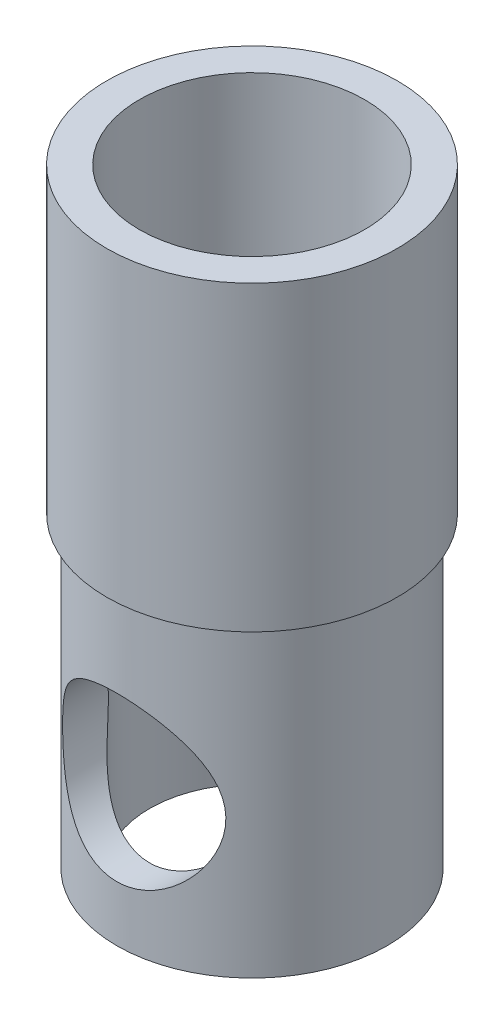
ISO-10303-21;
HEADER;
FILE_DESCRIPTION(('STEP AP214'),'2;1');
FILE_NAME('part.step','',(''),(''),'','','');
FILE_SCHEMA(('AUTOMOTIVE_DESIGN { 1 0 10303 214 1 1 1 1 }'));
ENDSEC;
DATA;
#1=APPLICATION_CONTEXT('core data for automotive mechanical design processes');
#2=APPLICATION_PROTOCOL_DEFINITION('international standard','automotive_design',2000,#1);
#3=PRODUCT_CONTEXT('',#1,'mechanical');
#4=PRODUCT('Part','Part','',(#3));
#5=PRODUCT_RELATED_PRODUCT_CATEGORY('part','',(#4));
#6=PRODUCT_DEFINITION_FORMATION('','',#4);
#7=PRODUCT_DEFINITION_CONTEXT('part definition',#1,'design');
#8=PRODUCT_DEFINITION('design','',#6,#7);
#9=PRODUCT_DEFINITION_SHAPE('','',#8);
#10=(LENGTH_UNIT() NAMED_UNIT(*) SI_UNIT(.MILLI.,.METRE.));
#11=(NAMED_UNIT(*) PLANE_ANGLE_UNIT() SI_UNIT($,.RADIAN.));
#12=(NAMED_UNIT(*) SI_UNIT($,.STERADIAN.) SOLID_ANGLE_UNIT());
#13=UNCERTAINTY_MEASURE_WITH_UNIT(LENGTH_MEASURE(1.E-05),#10,'distance_accuracy_value','');
#14=(GEOMETRIC_REPRESENTATION_CONTEXT(3) GLOBAL_UNCERTAINTY_ASSIGNED_CONTEXT((#13)) GLOBAL_UNIT_ASSIGNED_CONTEXT((#10,
#11,#12)) REPRESENTATION_CONTEXT('',''));
#15=CARTESIAN_POINT('',(0.,0.,0.));
#16=DIRECTION('',(0.,0.,1.));
#17=DIRECTION('',(1.,0.,0.));
#18=AXIS2_PLACEMENT_3D('',#15,#16,#17);
#19=CARTESIAN_POINT('',(0.,-17.8,0.));
#20=DIRECTION('',(0.,1.,0.));
#21=DIRECTION('',(0.,0.,1.));
#22=AXIS2_PLACEMENT_3D('',#19,#20,#21);
#23=CYLINDRICAL_SURFACE('',#22,8.28);
#24=CARTESIAN_POINT('',(0.,1.,0.));
#25=DIRECTION('',(0.,1.,0.));
#26=DIRECTION('',(0.,0.,1.));
#27=AXIS2_PLACEMENT_3D('',#24,#25,#26);
#28=CIRCLE('',#27,8.28);
#29=CARTESIAN_POINT('',(0.,1.,8.28));
#30=VERTEX_POINT('',#29);
#31=EDGE_CURVE('E47',#30,#30,#28,.T.);
#32=ORIENTED_EDGE('',*,*,#31,.F.);
#33=EDGE_LOOP('',(#32));
#34=FACE_BOUND('',#33,.T.);
#35=CARTESIAN_POINT('',(0.,-17.8,0.));
#36=DIRECTION('',(0.,1.,0.));
#37=DIRECTION('',(0.,0.,1.));
#38=AXIS2_PLACEMENT_3D('',#35,#36,#37);
#39=CIRCLE('',#38,8.28);
#40=CARTESIAN_POINT('',(0.,-17.8,8.28));
#41=VERTEX_POINT('',#40);
#42=EDGE_CURVE('E10',#41,#41,#39,.T.);
#43=ORIENTED_EDGE('',*,*,#42,.T.);
#44=EDGE_LOOP('',(#43));
#45=FACE_BOUND('',#44,.T.);
#46=CARTESIAN_POINT('',(0.,-14.4,8.28));
#47=CARTESIAN_POINT('',(-0.127814799959021,-14.399998989137,8.27999905401698));
#48=CARTESIAN_POINT('',(-0.2556580150913,-14.3950915080494,8.27703307383215));
#49=CARTESIAN_POINT('',(-0.510377679655769,-14.3755247882118,8.26523972434308));
#50=CARTESIAN_POINT('',(-0.637253545087955,-14.3608600678983,8.25640906029679));
#51=CARTESIAN_POINT('',(-0.889236612027991,-14.3219445877026,8.23308541018477));
#52=CARTESIAN_POINT('',(-1.01434015993517,-14.2976763684179,8.218582111688));
#53=CARTESIAN_POINT('',(-1.26168781014748,-14.2398642187082,8.18426205287179));
#54=CARTESIAN_POINT('',(-1.38393066550779,-14.2063163221467,8.16444302071664));
#55=CARTESIAN_POINT('',(-1.62406390141582,-14.1305578613842,8.12007628986708));
#56=CARTESIAN_POINT('',(-1.74197432894678,-14.0883953764538,8.09555488057994));
#57=CARTESIAN_POINT('',(-1.97350044520933,-13.9957441753168,8.04225312491289));
#58=CARTESIAN_POINT('',(-2.08711447483184,-13.9452522821589,8.01347115392769));
#59=CARTESIAN_POINT('',(-2.42048477896346,-13.7820509159312,7.92165580081726));
#60=CARTESIAN_POINT('',(-2.63306677536784,-13.6575205935488,7.85309574177827));
#61=CARTESIAN_POINT('',(-3.05094236899353,-13.370019231831,7.70087245643425));
#62=CARTESIAN_POINT('',(-3.2544139066575,-13.2048263790288,7.61645272728185));
#63=CARTESIAN_POINT('',(-3.6325660758696,-12.8456568346002,7.44353089859535));
#64=CARTESIAN_POINT('',(-3.80720890101852,-12.6516429699368,7.35502363012309));
#65=CARTESIAN_POINT('',(-4.14477814512416,-12.211934590916,7.17081535323676));
#66=CARTESIAN_POINT('',(-4.30353531322219,-11.9628128830754,7.07559156402027));
#67=CARTESIAN_POINT('',(-4.57635785947899,-11.4358280340893,6.90228727460239));
#68=CARTESIAN_POINT('',(-4.69049629710975,-11.1580128273752,6.8241788423886));
#69=CARTESIAN_POINT('',(-4.84643888571484,-10.6506931448338,6.71395784927723));
#70=CARTESIAN_POINT('',(-4.89910112224796,-10.4259611828117,6.67527072976169));
#71=CARTESIAN_POINT('',(-4.97291736325497,-9.96879628547392,6.620474860866));
#72=CARTESIAN_POINT('',(-4.99411133116625,-9.73637350154435,6.60433747576561));
#73=CARTESIAN_POINT('',(-5.00375967004685,-9.26996523743167,6.59703273740004));
#74=CARTESIAN_POINT('',(-4.99214675538867,-9.0359775289862,6.60591670182657));
#75=CARTESIAN_POINT('',(-4.93678463229914,-8.57392935931796,6.64738180811096));
#76=CARTESIAN_POINT('',(-4.893010987544,-8.34587354175881,6.67998096903299));
#77=CARTESIAN_POINT('',(-4.7765378674834,-7.90464933496691,6.76373237143766));
#78=CARTESIAN_POINT('',(-4.70426176575395,-7.69131447378392,6.81461213213665));
#79=CARTESIAN_POINT('',(-4.53345607100019,-7.27925094601696,6.92941090138581));
#80=CARTESIAN_POINT('',(-4.43491691120353,-7.08052763566577,6.99333465944446));
#81=CARTESIAN_POINT('',(-4.19434974772518,-6.66602965119449,7.14066242358086));
#82=CARTESIAN_POINT('',(-4.04771356980097,-6.4534490069667,7.22551257098683));
#83=CARTESIAN_POINT('',(-3.72395137644406,-6.05360065525499,7.39757957508199));
#84=CARTESIAN_POINT('',(-3.54679583070187,-5.86635778066316,7.48479865443306));
#85=CARTESIAN_POINT('',(-3.2464840236777,-5.59446685026863,7.61794495875607));
#86=CARTESIAN_POINT('',(-3.13264755828196,-5.50019596144178,7.66557498622801));
#87=CARTESIAN_POINT('',(-2.89633506754753,-5.32162326163593,7.75794499190333));
#88=CARTESIAN_POINT('',(-2.77386239663795,-5.23731761369317,7.80268607941834));
#89=CARTESIAN_POINT('',(-2.52082809644101,-5.07938983058989,7.88807083689139));
#90=CARTESIAN_POINT('',(-2.39026528799418,-5.00576925805934,7.92871390727352));
#91=CARTESIAN_POINT('',(-2.1218842491955,-4.87007775285377,8.00471342565388));
#92=CARTESIAN_POINT('',(-1.98407055912673,-4.80799970047281,8.04007312989869));
#93=CARTESIAN_POINT('',(-1.71074312298416,-4.69961425777457,8.10248027134194));
#94=CARTESIAN_POINT('',(-1.57560677302415,-4.65257310455158,8.12990452172536));
#95=CARTESIAN_POINT('',(-1.30080558918942,-4.57004458421711,8.17837104429402));
#96=CARTESIAN_POINT('',(-1.16114335151334,-4.53455071782873,8.19941690603458));
#97=CARTESIAN_POINT('',(-0.878528653152941,-4.47567205662101,8.23449127571659));
#98=CARTESIAN_POINT('',(-0.735578765756743,-4.45227810677489,8.24852508883336));
#99=CARTESIAN_POINT('',(-0.447663505369589,-4.41797175889034,8.26914840748581));
#100=CARTESIAN_POINT('',(-0.302698427690869,-4.40705755114698,8.27573899237276));
#101=CARTESIAN_POINT('',(-0.032303478460747,-4.39853534307774,8.28088420590736));
#102=CARTESIAN_POINT('',(0.0930599039964685,-4.39929811604266,8.28042278080918));
#103=CARTESIAN_POINT('',(0.343269314852998,-4.41022557838245,8.27382793650194));
#104=CARTESIAN_POINT('',(0.468115171826912,-4.42039316644576,8.26769276857042));
#105=CARTESIAN_POINT('',(0.716246544654471,-4.44999015781219,8.24990049826994));
#106=CARTESIAN_POINT('',(0.83953270079289,-4.46941562498298,8.23824574265339));
#107=CARTESIAN_POINT('',(1.0837671643727,-4.51728128010887,8.20968779420892));
#108=CARTESIAN_POINT('',(1.20471455126711,-4.54572494399462,8.19278257771984));
#109=CARTESIAN_POINT('',(1.44022006490596,-4.61039968831374,8.15463102909104));
#110=CARTESIAN_POINT('',(1.55486254010749,-4.64640040605383,8.13351387427528));
#111=CARTESIAN_POINT('',(1.78053348847966,-4.72623870429255,8.08711291225984));
#112=CARTESIAN_POINT('',(1.89156070189417,-4.77007898270104,8.06182767088794));
#113=CARTESIAN_POINT('',(2.21831819512106,-4.91274332545923,7.9804588927263));
#114=CARTESIAN_POINT('',(2.42790065021433,-5.02275999554512,7.91883260875659));
#115=CARTESIAN_POINT('',(2.84772741198661,-5.28204383555201,7.77835949917836));
#116=CARTESIAN_POINT('',(3.05579573269604,-5.43419467003682,7.69839056763918));
#117=CARTESIAN_POINT('',(3.44503942992681,-5.76717766913709,7.53226084102553));
#118=CARTESIAN_POINT('',(3.62618313957044,-5.94804309707899,7.44609292907667));
#119=CARTESIAN_POINT('',(3.98117274187309,-6.36124860152288,7.26316751896415));
#120=CARTESIAN_POINT('',(4.15085858866158,-6.59723456564839,7.16652254065104));
#121=CARTESIAN_POINT('',(4.44837831603031,-7.09853925368765,6.9857466968751));
#122=CARTESIAN_POINT('',(4.57625423649267,-7.3638281520823,6.90160330781262));
#123=CARTESIAN_POINT('',(4.76231972800488,-7.85913401022268,6.77411663386007));
#124=CARTESIAN_POINT('',(4.82958880733965,-8.08442824547146,6.72588835203027));
#125=CARTESIAN_POINT('',(4.90645334289188,-8.43010918474908,6.66978882403382));
#126=CARTESIAN_POINT('',(4.92806694679441,-8.54660861867642,6.65379727389108));
#127=CARTESIAN_POINT('',(4.96301423923288,-8.78148343995689,6.62777315179953));
#128=CARTESIAN_POINT('',(4.97635113384399,-8.8998580826819,6.61773827253376));
#129=CARTESIAN_POINT('',(4.99457389134283,-9.13813507159654,6.60399588520129));
#130=CARTESIAN_POINT('',(4.9994232455336,-9.25804179355239,6.60031571246763));
#131=CARTESIAN_POINT('',(5.00047976543356,-9.49791537217881,6.59951533865));
#132=CARTESIAN_POINT('',(4.9966869213365,-9.61788222891747,6.60239514500959));
#133=CARTESIAN_POINT('',(4.98051796908317,-9.85693817185625,6.6146008289241));
#134=CARTESIAN_POINT('',(4.96813960585116,-9.97602701913064,6.62392840004923));
#135=CARTESIAN_POINT('',(4.93500346073603,-10.2124100232206,6.64865075419455));
#136=CARTESIAN_POINT('',(4.91424239791221,-10.329703458644,6.66404791276061));
#137=CARTESIAN_POINT('',(4.84245682056759,-10.6652772892124,6.71658108347069));
#138=CARTESIAN_POINT('',(4.78095689159326,-10.8802998381778,6.76085655038456));
#139=CARTESIAN_POINT('',(4.63147885920864,-11.2969850696229,6.86410778629985));
#140=CARTESIAN_POINT('',(4.54349071964827,-11.4986426528358,6.92308912576948));
#141=CARTESIAN_POINT('',(4.32813027370673,-11.9160567206369,7.06005302022736));
#142=CARTESIAN_POINT('',(4.19679537859072,-12.129262968751,7.13956179724272));
#143=CARTESIAN_POINT('',(3.9048278127975,-12.5327931308518,7.30333616820837));
#144=CARTESIAN_POINT('',(3.74417091014908,-12.7230979013931,7.3876056563851));
#145=CARTESIAN_POINT('',(3.46833519197884,-13.0044127538445,7.51942975837754));
#146=CARTESIAN_POINT('',(3.36195607484711,-13.1038522423125,7.56770623125841));
#147=CARTESIAN_POINT('',(3.14042977533258,-13.2934484798563,7.66228320630056));
#148=CARTESIAN_POINT('',(3.02528551187502,-13.3836082958806,7.70858435832757));
#149=CARTESIAN_POINT('',(2.78659253045055,-13.5540863188849,7.79804885598916));
#150=CARTESIAN_POINT('',(2.66303575578666,-13.6343948791042,7.84120910937004));
#151=CARTESIAN_POINT('',(2.40828529952102,-13.7842884755299,7.92315902789155));
#152=CARTESIAN_POINT('',(2.27709594594655,-13.8538795089726,7.96195113403718));
#153=CARTESIAN_POINT('',(2.01123114332619,-13.9799604972123,8.03316885406246));
#154=CARTESIAN_POINT('',(1.87672961448513,-14.0367390139502,8.06573146764511));
#155=CARTESIAN_POINT('',(1.6021499842605,-14.1386221392424,8.12472858617453));
#156=CARTESIAN_POINT('',(1.46207519168216,-14.1837335585748,8.15116666543145));
#157=CARTESIAN_POINT('',(1.17784251923966,-14.2615157720931,8.19705753914945));
#158=CARTESIAN_POINT('',(1.03369775047637,-14.294222493737,8.21653049706998));
#159=CARTESIAN_POINT('',(0.742361195213597,-14.3467944589806,8.24795293455852));
#160=CARTESIAN_POINT('',(0.595172005054251,-14.3666702139602,8.25990857225337));
#161=CARTESIAN_POINT('',(0.372956022609537,-14.3866296552276,8.27193160197989));
#162=CARTESIAN_POINT('',(0.298492219692972,-14.3916405251432,8.27495429531049));
#163=CARTESIAN_POINT('',(0.149355517256566,-14.3983260616095,8.27898881213243));
#164=CARTESIAN_POINT('',(0.0746826092453347,-14.4000005906506,8.280000552741));
#165=CARTESIAN_POINT('',(0.,-14.4,8.28));
#166=B_SPLINE_CURVE_WITH_KNOTS('',3,(#46,#47,#48,#49,#50,#51,#52,#53,#54,#55,#56,#57,#58,#59,
#60,#61,#62,#63,#64,#65,#66,#67,#68,#69,#70,#71,#72,#73,#74,#75,#76,#77,#78,#79,#80,#81,#82,#83,
#84,#85,#86,#87,#88,#89,#90,#91,#92,#93,#94,#95,#96,#97,#98,#99,#100,#101,#102,#103,#104,#105,
#106,#107,#108,#109,#110,#111,#112,#113,#114,#115,#116,#117,#118,#119,#120,#121,#122,#123,#124,
#125,#126,#127,#128,#129,#130,#131,#132,#133,#134,#135,#136,#137,#138,#139,#140,#141,#142,#143,
#144,#145,#146,#147,#148,#149,#150,#151,#152,#153,#154,#155,#156,#157,#158,#159,#160,#161,#162,
#163,#164,#165),.UNSPECIFIED.,.T.,.F.,(4,2,2,2,2,2,2,2,2,2,2,2,2,2,2,2,2,2,2,2,2,2,2,2,2,2,2,2,
2,2,2,2,2,2,2,2,2,2,2,2,2,2,2,2,2,2,2,2,2,2,2,2,2,2,2,2,2,2,2,4),(0.,0.383366086203991,
0.766947727427517,1.15122995734657,1.53567668404194,1.91803365773239,2.30053680627112,
3.06460112029339,3.88750705558618,4.71148373279119,5.63809849690658,6.56318958646828,
7.26234313035077,7.9606080156014,8.66030605378807,9.36053628615764,10.0507350602351,
10.7411855955686,11.5536684663773,12.3669419508678,12.8323057885427,13.2974898572576,
13.7627418880278,14.2277059810868,14.6641511664,15.1003502761274,15.536218864741,
15.9720242394191,16.3476537427484,16.7233990586507,17.0989847628698,17.4747154073943,
17.8403268389851,18.2060643352503,18.9369890179331,19.7435539330616,20.5510600931223,
21.4657487630982,22.3795148647277,23.0963211038503,23.4546201907535,23.8127803997564,
24.1724774638403,24.5321749360708,24.8919669223739,25.2518998659199,25.9329330521669,
26.614224601361,27.399564151216,28.1855556758721,28.6453252127485,29.104942303701,
29.5650059376013,30.0248111896349,30.4729041132157,30.9207348648853,31.3672584851018,
31.8134158386362,32.0374086756102,32.2614107444087),.UNSPECIFIED.);
#167=CARTESIAN_POINT('',(0.,-14.4,8.28));
#168=VERTEX_POINT('',#167);
#169=EDGE_CURVE('E65',#168,#168,#166,.T.);
#170=ORIENTED_EDGE('',*,*,#169,.T.);
#171=EDGE_LOOP('',(#170));
#172=FACE_BOUND('',#171,.T.);
#173=ADVANCED_FACE('F30',(#34,#45,#172),#23,.T.);
#174=CARTESIAN_POINT('',(0.,-17.8,0.));
#175=DIRECTION('',(0.,1.,0.));
#176=DIRECTION('',(0.,0.,1.));
#177=AXIS2_PLACEMENT_3D('',#174,#175,#176);
#178=CYLINDRICAL_SURFACE('',#177,6.28);
#179=CARTESIAN_POINT('',(0.,-17.8,0.));
#180=DIRECTION('',(0.,1.,0.));
#181=DIRECTION('',(0.,0.,1.));
#182=AXIS2_PLACEMENT_3D('',#179,#180,#181);
#183=CIRCLE('',#182,6.28);
#184=CARTESIAN_POINT('',(0.,-17.8,6.28));
#185=VERTEX_POINT('',#184);
#186=EDGE_CURVE('E43',#185,#185,#183,.T.);
#187=ORIENTED_EDGE('',*,*,#186,.F.);
#188=EDGE_LOOP('',(#187));
#189=FACE_BOUND('',#188,.T.);
#190=CARTESIAN_POINT('',(0.,1.,0.));
#191=DIRECTION('',(0.,1.,0.));
#192=DIRECTION('',(0.,0.,1.));
#193=AXIS2_PLACEMENT_3D('',#190,#191,#192);
#194=CIRCLE('',#193,6.28);
#195=CARTESIAN_POINT('',(0.,1.,6.28));
#196=VERTEX_POINT('',#195);
#197=EDGE_CURVE('E52',#196,#196,#194,.T.);
#198=ORIENTED_EDGE('',*,*,#197,.T.);
#199=EDGE_LOOP('',(#198));
#200=FACE_BOUND('',#199,.T.);
#201=CARTESIAN_POINT('',(0.,-14.4,6.28));
#202=CARTESIAN_POINT('',(-0.120257222115343,-14.3999997971753,6.27999980830676));
#203=CARTESIAN_POINT('',(-0.240516560595724,-14.3956543949574,6.27653844648517));
#204=CARTESIAN_POINT('',(-0.480064504933532,-14.3783499630518,6.26277425134636));
#205=CARTESIAN_POINT('',(-0.599352676491982,-14.3653872732307,6.25246851092845));
#206=CARTESIAN_POINT('',(-0.836104451191791,-14.3310496042077,6.22523411750495));
#207=CARTESIAN_POINT('',(-0.953565493119829,-14.309663759318,6.20829691021834));
#208=CARTESIAN_POINT('',(-1.18566715289839,-14.2588409220026,6.16818416127117));
#209=CARTESIAN_POINT('',(-1.30030646499959,-14.2294002758385,6.14500578863118));
#210=CARTESIAN_POINT('',(-1.6373097692009,-14.1300846219876,6.06715642723112));
#211=CARTESIAN_POINT('',(-1.85451462548514,-14.0489520689393,6.00395848988684));
#212=CARTESIAN_POINT('',(-2.27049176890447,-13.8606210427031,5.85934300167095));
#213=CARTESIAN_POINT('',(-2.46926216855176,-13.7534199044368,5.77792358802503));
#214=CARTESIAN_POINT('',(-2.78474482667046,-13.555439125972,5.63056458409287));
#215=CARTESIAN_POINT('',(-2.90706062970712,-13.4707247016339,5.56824958734855));
#216=CARTESIAN_POINT('',(-3.14218233162476,-13.2921051719412,5.43903252931013));
#217=CARTESIAN_POINT('',(-3.25498864650368,-13.1982004690094,5.37213066890339));
#218=CARTESIAN_POINT('',(-3.47122057557,-13.001671807977,5.23502303333573));
#219=CARTESIAN_POINT('',(-3.57461892451574,-12.899024078192,5.16480849812808));
#220=CARTESIAN_POINT('',(-3.77158558743826,-12.6857588415876,5.02277606694793));
#221=CARTESIAN_POINT('',(-3.86515500055616,-12.5751422282423,4.95095835134581));
#222=CARTESIAN_POINT('',(-4.04373495987583,-12.3444545405938,4.80624732088297));
#223=CARTESIAN_POINT('',(-4.12859214619974,-12.2242644389501,4.7333544109468));
#224=CARTESIAN_POINT('',(-4.28789893420709,-11.9759835092003,4.58953558642894));
#225=CARTESIAN_POINT('',(-4.36234528347339,-11.8478902300187,4.51861029206647));
#226=CARTESIAN_POINT('',(-4.50020971059341,-11.5840768689333,4.38131774575819));
#227=CARTESIAN_POINT('',(-4.56365794601208,-11.4483790378958,4.31493834144137));
#228=CARTESIAN_POINT('',(-4.67902971497666,-11.1690448031953,4.18955016932471));
#229=CARTESIAN_POINT('',(-4.73096305462508,-11.0254152853977,4.13053514887737));
#230=CARTESIAN_POINT('',(-4.82946028608787,-10.7069662453897,4.01514052699051));
#231=CARTESIAN_POINT('',(-4.87392348224628,-10.5307759530136,3.96060747166456));
#232=CARTESIAN_POINT('',(-4.92633211875968,-10.2600605530934,3.89492422017542));
#233=CARTESIAN_POINT('',(-4.94141544052408,-10.1688121092872,3.87572314874231));
#234=CARTESIAN_POINT('',(-4.9665781687652,-9.98457721045462,3.84342593948107));
#235=CARTESIAN_POINT('',(-4.97665999800466,-9.89159161961221,3.83032684599423));
#236=CARTESIAN_POINT('',(-4.99166793413992,-9.70366866809826,3.81074888258766));
#237=CARTESIAN_POINT('',(-4.99654769173295,-9.6087213210702,3.80432953964107));
#238=CARTESIAN_POINT('',(-5.00087074051898,-9.41848935345995,3.7986451878494));
#239=CARTESIAN_POINT('',(-5.00031428104344,-9.32320474854644,3.79937985088665));
#240=CARTESIAN_POINT('',(-4.99377741699221,-9.13309314930897,3.80796732996674));
#241=CARTESIAN_POINT('',(-4.98779386976495,-9.03826645213347,3.81582427028927));
#242=CARTESIAN_POINT('',(-4.97054413897634,-8.84986507529685,3.83826640854341));
#243=CARTESIAN_POINT('',(-4.95927515001793,-8.75629108770833,3.85285517951717));
#244=CARTESIAN_POINT('',(-4.92945463288738,-8.556008080524,3.89095755763263));
#245=CARTESIAN_POINT('',(-4.9100176621353,-8.44963365727503,3.91553575561215));
#246=CARTESIAN_POINT('',(-4.8647808627037,-8.24007872647032,3.97160021462346));
#247=CARTESIAN_POINT('',(-4.83897626728738,-8.13690067711324,4.00309164887297));
#248=CARTESIAN_POINT('',(-4.75257781681421,-7.83232591837709,4.10601689459029));
#249=CARTESIAN_POINT('',(-4.68305214910917,-7.63622777432749,4.18582928892582));
#250=CARTESIAN_POINT('',(-4.54395118223236,-7.30822881736848,4.3357261952285));
#251=CARTESIAN_POINT('',(-4.47908388475363,-7.17288788759428,4.40294888429646));
#252=CARTESIAN_POINT('',(-4.33849198155707,-6.91008382847807,4.54154416183581));
#253=CARTESIAN_POINT('',(-4.26276250164196,-6.78262427269671,4.6129186047341));
#254=CARTESIAN_POINT('',(-4.10077246012283,-6.53547067641011,4.75750737191615));
#255=CARTESIAN_POINT('',(-4.01449996474638,-6.41578567505015,4.8307237052384));
#256=CARTESIAN_POINT('',(-3.83169401628353,-6.18443690836312,4.97696919445331));
#257=CARTESIAN_POINT('',(-3.73516221069969,-6.07277185995497,5.04999837847637));
#258=CARTESIAN_POINT('',(-3.5294185910667,-5.85511936391334,5.19595083785518));
#259=CARTESIAN_POINT('',(-3.4199526985081,-5.74933996114422,5.26882704822786));
#260=CARTESIAN_POINT('',(-3.19042733870233,-5.54713581604474,5.41089559634816));
#261=CARTESIAN_POINT('',(-3.07036632887328,-5.45071244019747,5.48008739530968));
#262=CARTESIAN_POINT('',(-2.82016223224691,-5.26834247872472,5.61294074789797));
#263=CARTESIAN_POINT('',(-2.69004313246643,-5.18237215271397,5.67661473497893));
#264=CARTESIAN_POINT('',(-2.4199237484284,-5.02180104012199,5.79691299180892));
#265=CARTESIAN_POINT('',(-2.27992803509003,-4.94719504395544,5.85354048958514));
#266=CARTESIAN_POINT('',(-2.03270868691041,-4.83042707302666,5.94293089569191));
#267=CARTESIAN_POINT('',(-1.92773660636038,-4.78512663703715,5.97785552957131));
#268=CARTESIAN_POINT('',(-1.71360208027534,-4.70140716755728,6.04272068679771));
#269=CARTESIAN_POINT('',(-1.60444068246848,-4.6629864269325,6.07266244646948));
#270=CARTESIAN_POINT('',(-1.38247745779935,-4.59351735693435,6.12700640261896));
#271=CARTESIAN_POINT('',(-1.26967658404001,-4.56246711489825,6.15141003618176));
#272=CARTESIAN_POINT('',(-1.04113523077006,-4.5081881609313,6.19418629457415));
#273=CARTESIAN_POINT('',(-0.925396146091908,-4.48495580967969,6.21256172550314));
#274=CARTESIAN_POINT('',(-0.691093887604889,-4.44656100512939,6.2429816335622));
#275=CARTESIAN_POINT('',(-0.572518681477943,-4.43144364406827,6.25499073065018));
#276=CARTESIAN_POINT('',(-0.33414561660552,-4.40974318097346,6.2722419986413));
#277=CARTESIAN_POINT('',(-0.214348272665606,-4.40315662386865,6.27748690911209));
#278=CARTESIAN_POINT('',(0.0255247568593274,-4.39862625105178,6.28109365082453));
#279=CARTESIAN_POINT('',(0.145600466502749,-4.40068321249968,6.27945486313598));
#280=CARTESIAN_POINT('',(0.384997729557393,-4.41340343146341,6.26933255056526));
#281=CARTESIAN_POINT('',(0.504319317910004,-4.42406628724418,6.26084934518996));
#282=CARTESIAN_POINT('',(0.732043239856821,-4.4526533284835,6.23815433861876));
#283=CARTESIAN_POINT('',(0.840574559087486,-4.46995003385025,6.22443799573575));
#284=CARTESIAN_POINT('',(1.05549280915401,-4.51144881595744,6.19162130456259));
#285=CARTESIAN_POINT('',(1.16187904142091,-4.53565310454143,6.17251923175777));
#286=CARTESIAN_POINT('',(1.47683505592329,-4.61816340782247,6.10763321423354));
#287=CARTESIAN_POINT('',(1.68135234295274,-4.68638627039519,6.0542538372174));
#288=CARTESIAN_POINT('',(2.08849059730273,-4.85140576715854,5.92665118400657));
#289=CARTESIAN_POINT('',(2.29009129377432,-4.94979395630704,5.85128271113499));
#290=CARTESIAN_POINT('',(2.67392038896256,-5.16927360393175,5.68614282571582));
#291=CARTESIAN_POINT('',(2.85614822460126,-5.29036572202184,5.59637099472055));
#292=CARTESIAN_POINT('',(3.23295281791247,-5.57713378122956,5.38897601255671));
#293=CARTESIAN_POINT('',(3.42326670331854,-5.746908416076,5.26930527736855));
#294=CARTESIAN_POINT('',(3.77481163719396,-6.11135770451344,5.02347220043289));
#295=CARTESIAN_POINT('',(3.93595121173375,-6.30610751324732,4.89729098201912));
#296=CARTESIAN_POINT('',(4.17006021218717,-6.63705003077872,4.69707580343764));
#297=CARTESIAN_POINT('',(4.25270639679892,-6.76596590419944,4.62214160307402));
#298=CARTESIAN_POINT('',(4.40661438512304,-7.03241799477897,4.47564733774341));
#299=CARTESIAN_POINT('',(4.47787001922039,-7.16995882781598,4.40408911604293));
#300=CARTESIAN_POINT('',(4.6080542957728,-7.45320267517748,4.26767999158331));
#301=CARTESIAN_POINT('',(4.66703068010772,-7.59887117548339,4.2028036268129));
#302=CARTESIAN_POINT('',(4.77192965701886,-7.89870127015035,4.08330690727955));
#303=CARTESIAN_POINT('',(4.81786923392138,-8.05285149884918,4.02867324015292));
#304=CARTESIAN_POINT('',(4.89815998777536,-8.38094906989787,3.93074914574314));
#305=CARTESIAN_POINT('',(4.93142383128217,-8.55552063788791,3.88857429413123));
#306=CARTESIAN_POINT('',(4.96728787643327,-8.8219826939526,3.84250074637449));
#307=CARTESIAN_POINT('',(4.97690232300143,-8.91151413185376,3.83001010417259));
#308=CARTESIAN_POINT('',(4.99129546790451,-9.09159640676653,3.81123539714164));
#309=CARTESIAN_POINT('',(4.9960762246214,-9.18214679324407,3.8049486904516));
#310=CARTESIAN_POINT('',(5.00070117807988,-9.36399948630389,3.79886887588045));
#311=CARTESIAN_POINT('',(5.00052324573524,-9.45530334506701,3.79910487677495));
#312=CARTESIAN_POINT('',(4.99518928663333,-9.6374951690663,3.80611247590884));
#313=CARTESIAN_POINT('',(4.99003332646439,-9.72838313984923,3.81288398672634));
#314=CARTESIAN_POINT('',(4.96722635151795,-9.99959022667838,3.8426247647633));
#315=CARTESIAN_POINT('',(4.94223329787723,-10.1783274048366,3.87502385712642));
#316=CARTESIAN_POINT('',(4.8640225048856,-10.5813821879915,3.97297883063419));
#317=CARTESIAN_POINT('',(4.80445793692274,-10.8026581621224,4.04569874546912));
#318=CARTESIAN_POINT('',(4.69563815632848,-11.1215375355465,4.1704278271413));
#319=CARTESIAN_POINT('',(4.65602406723859,-11.2258467659607,4.21471302375479));
#320=CARTESIAN_POINT('',(4.57064051298264,-11.4301434742514,4.30715653236804));
#321=CARTESIAN_POINT('',(4.5248723364528,-11.5301318511174,4.35531403267971));
#322=CARTESIAN_POINT('',(4.40674142493114,-11.7674733026741,4.47535645860371));
#323=CARTESIAN_POINT('',(4.33134904167218,-11.9026221489663,4.54861848102127));
#324=CARTESIAN_POINT('',(4.16914668640407,-12.1644047528685,4.69774147363126));
#325=CARTESIAN_POINT('',(4.08233201370204,-12.291034972147,4.77360350426555));
#326=CARTESIAN_POINT('',(3.89757018051878,-12.535669017717,4.92561094731099));
#327=CARTESIAN_POINT('',(3.7996262112889,-12.6536753009971,5.00175627246218));
#328=CARTESIAN_POINT('',(3.59280683072478,-12.8807091331822,5.15233323363947));
#329=CARTESIAN_POINT('',(3.48393467528276,-12.9897393388601,5.22676537200782));
#330=CARTESIAN_POINT('',(3.17619768916039,-13.2704199051466,5.42240586289454));
#331=CARTESIAN_POINT('',(2.96705372983022,-13.4333954538296,5.54046957718595));
#332=CARTESIAN_POINT('',(2.63124809298242,-13.6537589594883,5.70354990355787));
#333=CARTESIAN_POINT('',(2.51565460939773,-13.7231862456599,5.75556583967704));
#334=CARTESIAN_POINT('',(2.27733488118828,-13.853330817109,5.85394972984967));
#335=CARTESIAN_POINT('',(2.15461023681446,-13.9140500459718,5.90031894386735));
#336=CARTESIAN_POINT('',(1.92509535015297,-14.0159337153345,5.97866084454057));
#337=CARTESIAN_POINT('',(1.8193650975771,-14.0586544888294,6.01172634663885));
#338=CARTESIAN_POINT('',(1.60393234026253,-14.1371442880152,6.07275273421189));
#339=CARTESIAN_POINT('',(1.49423065954564,-14.1729147461135,6.10071467142056));
#340=CARTESIAN_POINT('',(1.27160998361741,-14.2369825259957,6.15096788971076));
#341=CARTESIAN_POINT('',(1.1586970120847,-14.265292933307,6.17326909760665));
#342=CARTESIAN_POINT('',(0.930215745325706,-14.3140957743785,6.2118043174469));
#343=CARTESIAN_POINT('',(0.814648518886042,-14.3345912984008,6.22804072756006));
#344=CARTESIAN_POINT('',(0.583030709562059,-14.3672516995204,6.25395008892245));
#345=CARTESIAN_POINT('',(0.467002240137358,-14.3795127993478,6.26369883853544));
#346=CARTESIAN_POINT('',(0.233983313222118,-14.3958879071289,6.27672456958525));
#347=CARTESIAN_POINT('',(0.116992658121461,-14.4000001973187,6.28000018648944));
#348=CARTESIAN_POINT('',(0.,-14.4,6.28));
#349=B_SPLINE_CURVE_WITH_KNOTS('',3,(#201,#202,#203,#204,#205,#206,#207,#208,#209,#210,#211,
#212,#213,#214,#215,#216,#217,#218,#219,#220,#221,#222,#223,#224,#225,#226,#227,#228,#229,#230,
#231,#232,#233,#234,#235,#236,#237,#238,#239,#240,#241,#242,#243,#244,#245,#246,#247,#248,#249,
#250,#251,#252,#253,#254,#255,#256,#257,#258,#259,#260,#261,#262,#263,#264,#265,#266,#267,#268,
#269,#270,#271,#272,#273,#274,#275,#276,#277,#278,#279,#280,#281,#282,#283,#284,#285,#286,#287,
#288,#289,#290,#291,#292,#293,#294,#295,#296,#297,#298,#299,#300,#301,#302,#303,#304,#305,#306,
#307,#308,#309,#310,#311,#312,#313,#314,#315,#316,#317,#318,#319,#320,#321,#322,#323,#324,#325,
#326,#327,#328,#329,#330,#331,#332,#333,#334,#335,#336,#337,#338,#339,#340,#341,#342,#343,#344,
#345,#346,#347,#348),.UNSPECIFIED.,.T.,.F.,(4,2,2,2,2,2,2,2,2,2,2,2,2,2,2,2,2,2,2,2,2,2,2,2,2,2,
2,2,2,2,2,2,2,2,2,2,2,2,2,2,2,2,2,2,2,2,2,2,2,2,2,2,2,2,2,2,2,2,2,2,2,2,2,2,2,2,2,2,2,2,2,2,2,
4),(0.,0.360647734141148,0.721448748869728,1.08271672152579,1.44414884143109,2.16172013364846,
2.87936481643195,3.36271254154861,3.84603911136136,4.33072454033711,4.8153557105298,
5.30742317998613,5.79964403292,6.29049306518625,6.78092247034414,7.34784094776949,
7.63093068851395,7.91388316410774,8.19933613679955,8.48477601728534,8.77038129240535,
9.05613833241998,9.38829946184819,9.72071000196143,10.3865705951418,10.8793964326011,
11.3724441121593,11.8660551397122,12.3595870196284,12.8652951299908,13.3710769901054,
13.8756877952565,14.3800665782767,14.7383651007776,15.096574591148,15.4546910233929,
15.8126405168324,16.1725589483267,16.5323315631954,16.892136526795,17.2519246951725,
17.5838017052416,17.915785103494,18.5793004539237,19.2867050062168,19.9941301138147,
20.8363475642129,21.6811616442452,22.192087625427,22.7032894153371,23.212464916705,
23.7209739875579,24.2665087930279,24.538939984326,24.8112551144052,25.0847856959726,
25.3583126187238,25.905736556429,26.6228192806811,26.982751927343,27.3426093228746,
27.8555859398763,28.3687743298615,28.8818159360922,29.3947051402846,30.2613327463276,
30.6944868698447,31.1275441650453,31.4833940684571,31.8391705559274,32.194318764973,
32.5493263907243,32.9001098601422,33.2509672666287),.UNSPECIFIED.);
#350=CARTESIAN_POINT('',(0.,-14.4,6.28));
#351=VERTEX_POINT('',#350);
#352=EDGE_CURVE('E34',#351,#351,#349,.T.);
#353=ORIENTED_EDGE('',*,*,#352,.F.);
#354=EDGE_LOOP('',(#353));
#355=FACE_BOUND('',#354,.T.);
#356=ADVANCED_FACE('F97',(#189,#200,#355),#178,.F.);
#357=CARTESIAN_POINT('',(0.,1.,0.));
#358=DIRECTION('',(0.,1.,0.));
#359=DIRECTION('',(0.,0.,1.));
#360=AXIS2_PLACEMENT_3D('',#357,#358,#359);
#361=PLANE('',#360);
#362=ORIENTED_EDGE('',*,*,#197,.F.);
#363=EDGE_LOOP('',(#362));
#364=FACE_BOUND('',#363,.T.);
#365=CARTESIAN_POINT('',(0.,1.,0.));
#366=DIRECTION('',(0.,1.,0.));
#367=DIRECTION('',(0.,0.,1.));
#368=AXIS2_PLACEMENT_3D('',#365,#366,#367);
#369=CIRCLE('',#368,6.9);
#370=CARTESIAN_POINT('',(0.,1.,6.9));
#371=VERTEX_POINT('',#370);
#372=EDGE_CURVE('E62',#371,#371,#369,.T.);
#373=ORIENTED_EDGE('',*,*,#372,.T.);
#374=EDGE_LOOP('',(#373));
#375=FACE_BOUND('',#374,.T.);
#376=ADVANCED_FACE('F95',(#364,#375),#361,.T.);
#377=CARTESIAN_POINT('',(0.,-17.8,0.));
#378=DIRECTION('',(0.,1.,0.));
#379=DIRECTION('',(0.,0.,1.));
#380=AXIS2_PLACEMENT_3D('',#377,#378,#379);
#381=PLANE('',#380);
#382=ORIENTED_EDGE('',*,*,#186,.T.);
#383=EDGE_LOOP('',(#382));
#384=FACE_BOUND('',#383,.T.);
#385=ORIENTED_EDGE('',*,*,#42,.F.);
#386=EDGE_LOOP('',(#385));
#387=FACE_BOUND('',#386,.T.);
#388=ADVANCED_FACE('F90',(#384,#387),#381,.F.);
#389=CARTESIAN_POINT('',(0.,1.,0.));
#390=DIRECTION('',(0.,1.,0.));
#391=DIRECTION('',(0.,0.,1.));
#392=AXIS2_PLACEMENT_3D('',#389,#390,#391);
#393=PLANE('',#392);
#394=CARTESIAN_POINT('',(0.,1.,0.));
#395=DIRECTION('',(0.,1.,0.));
#396=DIRECTION('',(0.,0.,1.));
#397=AXIS2_PLACEMENT_3D('',#394,#395,#396);
#398=CIRCLE('',#397,8.9);
#399=CARTESIAN_POINT('',(0.,1.,8.9));
#400=VERTEX_POINT('',#399);
#401=EDGE_CURVE('E56',#400,#400,#398,.T.);
#402=ORIENTED_EDGE('',*,*,#401,.F.);
#403=EDGE_LOOP('',(#402));
#404=FACE_BOUND('',#403,.T.);
#405=ORIENTED_EDGE('',*,*,#31,.T.);
#406=EDGE_LOOP('',(#405));
#407=FACE_BOUND('',#406,.T.);
#408=ADVANCED_FACE('F86',(#404,#407),#393,.F.);
#409=CARTESIAN_POINT('',(0.,19.5,0.));
#410=DIRECTION('',(0.,1.,0.));
#411=DIRECTION('',(0.,0.,1.));
#412=AXIS2_PLACEMENT_3D('',#409,#410,#411);
#413=PLANE('',#412);
#414=CARTESIAN_POINT('',(0.,19.5,0.));
#415=DIRECTION('',(0.,1.,0.));
#416=DIRECTION('',(0.,0.,1.));
#417=AXIS2_PLACEMENT_3D('',#414,#415,#416);
#418=CIRCLE('',#417,8.9);
#419=CARTESIAN_POINT('',(0.,19.5,8.9));
#420=VERTEX_POINT('',#419);
#421=EDGE_CURVE('E55',#420,#420,#418,.T.);
#422=ORIENTED_EDGE('',*,*,#421,.T.);
#423=EDGE_LOOP('',(#422));
#424=FACE_BOUND('',#423,.T.);
#425=CARTESIAN_POINT('',(0.,19.5,0.));
#426=DIRECTION('',(0.,1.,0.));
#427=DIRECTION('',(0.,0.,1.));
#428=AXIS2_PLACEMENT_3D('',#425,#426,#427);
#429=CIRCLE('',#428,6.9);
#430=CARTESIAN_POINT('',(0.,19.5,6.9));
#431=VERTEX_POINT('',#430);
#432=EDGE_CURVE('E59',#431,#431,#429,.T.);
#433=ORIENTED_EDGE('',*,*,#432,.F.);
#434=EDGE_LOOP('',(#433));
#435=FACE_BOUND('',#434,.T.);
#436=ADVANCED_FACE('F83',(#424,#435),#413,.T.);
#437=CARTESIAN_POINT('',(0.,19.5,0.));
#438=DIRECTION('',(0.,-1.,0.));
#439=DIRECTION('',(0.,0.,-1.));
#440=AXIS2_PLACEMENT_3D('',#437,#438,#439);
#441=CYLINDRICAL_SURFACE('',#440,8.9);
#442=ORIENTED_EDGE('',*,*,#421,.F.);
#443=EDGE_LOOP('',(#442));
#444=FACE_BOUND('',#443,.T.);
#445=ORIENTED_EDGE('',*,*,#401,.T.);
#446=EDGE_LOOP('',(#445));
#447=FACE_BOUND('',#446,.T.);
#448=ADVANCED_FACE('F81',(#444,#447),#441,.T.);
#449=CARTESIAN_POINT('',(0.,19.5,0.));
#450=DIRECTION('',(0.,-1.,0.));
#451=DIRECTION('',(0.,0.,-1.));
#452=AXIS2_PLACEMENT_3D('',#449,#450,#451);
#453=CYLINDRICAL_SURFACE('',#452,6.9);
#454=ORIENTED_EDGE('',*,*,#432,.T.);
#455=EDGE_LOOP('',(#454));
#456=FACE_BOUND('',#455,.T.);
#457=ORIENTED_EDGE('',*,*,#372,.F.);
#458=EDGE_LOOP('',(#457));
#459=FACE_BOUND('',#458,.T.);
#460=ADVANCED_FACE('F76',(#456,#459),#453,.F.);
#461=CARTESIAN_POINT('',(0.,-9.4,8.9));
#462=DIRECTION('',(0.,0.,-1.));
#463=DIRECTION('',(-1.,0.,0.));
#464=AXIS2_PLACEMENT_3D('',#461,#462,#463);
#465=CYLINDRICAL_SURFACE('',#464,5.);
#466=ORIENTED_EDGE('',*,*,#169,.F.);
#467=EDGE_LOOP('',(#466));
#468=FACE_BOUND('',#467,.T.);
#469=ORIENTED_EDGE('',*,*,#352,.T.);
#470=EDGE_LOOP('',(#469));
#471=FACE_BOUND('',#470,.T.);
#472=ADVANCED_FACE('F72',(#468,#471),#465,.F.);
#473=CLOSED_SHELL('',(#173,#356,#376,#388,#408,#436,#448,#460,#472));
#474=MANIFOLD_SOLID_BREP('B2',#473);
#475=ADVANCED_BREP_SHAPE_REPRESENTATION('',(#18,#474),#14);
#476=SHAPE_DEFINITION_REPRESENTATION(#9,#475);
ENDSEC;
END-ISO-10303-21;
